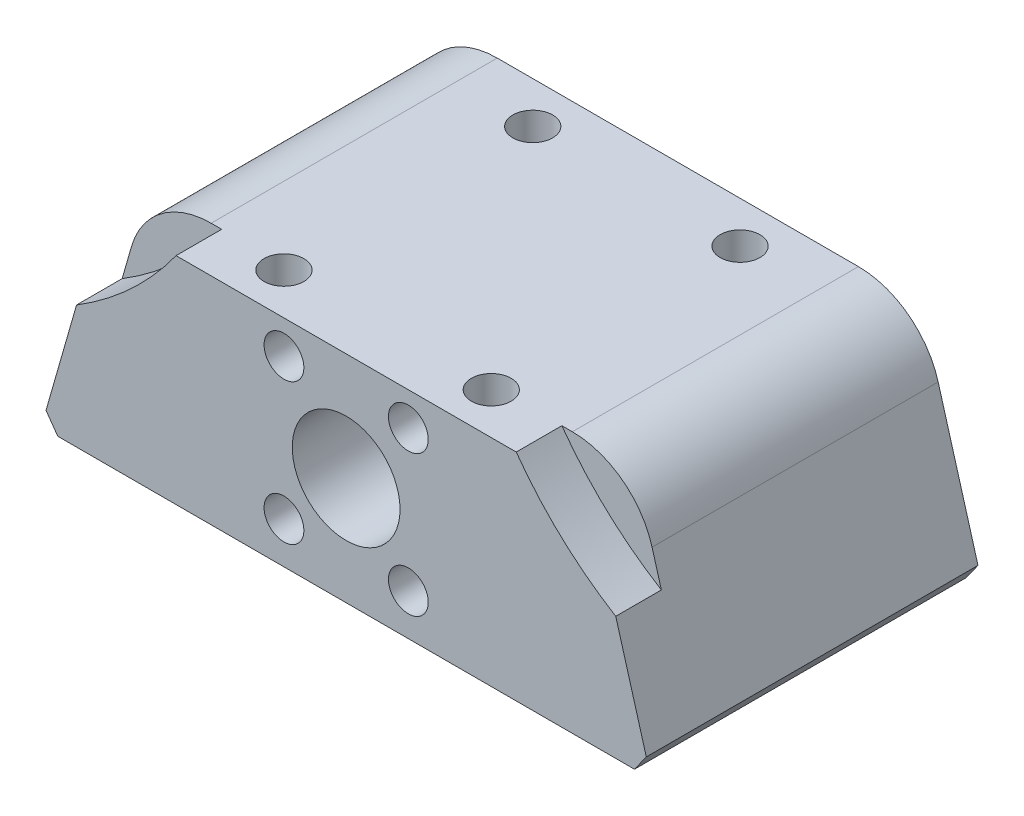
ISO-10303-21;
HEADER;
FILE_DESCRIPTION(('STEP AP214'),'2;1');
FILE_NAME('part.step','',(''),(''),'','','');
FILE_SCHEMA(('AUTOMOTIVE_DESIGN { 1 0 10303 214 1 1 1 1 }'));
ENDSEC;
DATA;
#1=APPLICATION_CONTEXT('core data for automotive mechanical design processes');
#2=APPLICATION_PROTOCOL_DEFINITION('international standard','automotive_design',2000,#1);
#3=PRODUCT_CONTEXT('',#1,'mechanical');
#4=PRODUCT('Part','Part','',(#3));
#5=PRODUCT_RELATED_PRODUCT_CATEGORY('part','',(#4));
#6=PRODUCT_DEFINITION_FORMATION('','',#4);
#7=PRODUCT_DEFINITION_CONTEXT('part definition',#1,'design');
#8=PRODUCT_DEFINITION('design','',#6,#7);
#9=PRODUCT_DEFINITION_SHAPE('','',#8);
#10=(LENGTH_UNIT() NAMED_UNIT(*) SI_UNIT(.MILLI.,.METRE.));
#11=(NAMED_UNIT(*) PLANE_ANGLE_UNIT() SI_UNIT($,.RADIAN.));
#12=(NAMED_UNIT(*) SI_UNIT($,.STERADIAN.) SOLID_ANGLE_UNIT());
#13=UNCERTAINTY_MEASURE_WITH_UNIT(LENGTH_MEASURE(1.E-05),#10,'distance_accuracy_value','');
#14=(GEOMETRIC_REPRESENTATION_CONTEXT(3) GLOBAL_UNCERTAINTY_ASSIGNED_CONTEXT((#13)) GLOBAL_UNIT_ASSIGNED_CONTEXT((#10,
#11,#12)) REPRESENTATION_CONTEXT('',''));
#15=CARTESIAN_POINT('',(0.,0.,0.));
#16=DIRECTION('',(0.,0.,1.));
#17=DIRECTION('',(1.,0.,0.));
#18=AXIS2_PLACEMENT_3D('',#15,#16,#17);
#19=CARTESIAN_POINT('',(-14.2784137068511,11.,40.));
#20=DIRECTION('',(0.,0.,-1.));
#21=DIRECTION('',(-1.,0.,0.));
#22=AXIS2_PLACEMENT_3D('',#19,#20,#21);
#23=CYLINDRICAL_SURFACE('',#22,10.);
#24=DIRECTION('',(0.,0.,-1.));
#25=VECTOR('',#24,1.);
#26=CARTESIAN_POINT('',(-23.8910306662343,13.75637355817,40.));
#27=LINE('',#26,#25);
#28=CARTESIAN_POINT('',(-23.8910306662343,13.75637355817,34.5));
#29=VERTEX_POINT('',#28);
#30=CARTESIAN_POINT('',(-23.8910306662343,13.75637355817,0.));
#31=VERTEX_POINT('',#30);
#32=EDGE_CURVE('E183',#29,#31,#27,.T.);
#33=ORIENTED_EDGE('',*,*,#32,.F.);
#34=CARTESIAN_POINT('',(-14.2784137068511,11.,34.5));
#35=DIRECTION('',(0.,0.,1.));
#36=DIRECTION('',(1.,0.,0.));
#37=AXIS2_PLACEMENT_3D('',#34,#35,#36);
#38=CIRCLE('',#37,10.);
#39=CARTESIAN_POINT('',(-14.2784137068511,21.,34.5));
#40=VERTEX_POINT('',#39);
#41=EDGE_CURVE('E185',#29,#40,#38,.F.);
#42=ORIENTED_EDGE('',*,*,#41,.T.);
#43=DIRECTION('',(0.,0.,-1.));
#44=VECTOR('',#43,1.);
#45=CARTESIAN_POINT('',(-14.2784137068511,21.,40.));
#46=LINE('',#45,#44);
#47=CARTESIAN_POINT('',(-14.2784137068511,21.,0.));
#48=VERTEX_POINT('',#47);
#49=EDGE_CURVE('E162',#48,#40,#46,.F.);
#50=ORIENTED_EDGE('',*,*,#49,.F.);
#51=CARTESIAN_POINT('',(-14.2784137068511,11.,0.));
#52=DIRECTION('',(0.,0.,1.));
#53=DIRECTION('',(1.,0.,0.));
#54=AXIS2_PLACEMENT_3D('',#51,#52,#53);
#55=CIRCLE('',#54,10.);
#56=EDGE_CURVE('E175',#31,#48,#55,.F.);
#57=ORIENTED_EDGE('',*,*,#56,.F.);
#58=EDGE_LOOP('',(#33,#42,#50,#57));
#59=FACE_BOUND('',#58,.T.);
#60=ADVANCED_FACE('F36',(#59),#23,.T.);
#61=CARTESIAN_POINT('',(0.,0.,40.));
#62=DIRECTION('',(0.,0.,1.));
#63=DIRECTION('',(1.,0.,0.));
#64=AXIS2_PLACEMENT_3D('',#61,#62,#63);
#65=PLANE('',#64);
#66=DIRECTION('',(0.580682206213755,0.814130318429873,0.));
#67=VECTOR('',#66,1.);
#68=CARTESIAN_POINT('',(43.6958434660905,-3.,40.));
#69=LINE('',#68,#67);
#70=CARTESIAN_POINT('',(42.2693342376081,-4.99999999999999,40.));
#71=VERTEX_POINT('',#70);
#72=CARTESIAN_POINT('',(43.6958434660905,-3.,40.));
#73=VERTEX_POINT('',#72);
#74=EDGE_CURVE('E50',#71,#73,#69,.T.);
#75=ORIENTED_EDGE('',*,*,#74,.T.);
#76=DIRECTION('',(-0.275637355817003,0.961261695938318,0.));
#77=VECTOR('',#76,1.);
#78=CARTESIAN_POINT('',(36.813954207879,21.,40.));
#79=LINE('',#78,#77);
#80=CARTESIAN_POINT('',(40.0118946534754,9.8474562994844,40.));
#81=VERTEX_POINT('',#80);
#82=EDGE_CURVE('E136',#73,#81,#79,.T.);
#83=ORIENTED_EDGE('',*,*,#82,.T.);
#84=CARTESIAN_POINT('',(61.5,45.,40.));
#85=DIRECTION('',(0.,0.,1.));
#86=DIRECTION('',(-1.,0.,0.));
#87=AXIS2_PLACEMENT_3D('',#84,#85,#86);
#88=CIRCLE('',#87,41.2);
#89=CARTESIAN_POINT('',(28.0120917344782,21.,40.));
#90=VERTEX_POINT('',#89);
#91=EDGE_CURVE('E210',#90,#81,#88,.T.);
#92=ORIENTED_EDGE('',*,*,#91,.F.);
#93=DIRECTION('',(-1.,0.,0.));
#94=VECTOR('',#93,1.);
#95=CARTESIAN_POINT('',(-21.813954207879,21.,40.));
#96=LINE('',#95,#94);
#97=CARTESIAN_POINT('',(-13.0120917344782,21.,40.));
#98=VERTEX_POINT('',#97);
#99=EDGE_CURVE('E146',#90,#98,#96,.T.);
#100=ORIENTED_EDGE('',*,*,#99,.T.);
#101=CARTESIAN_POINT('',(-46.5,45.,40.));
#102=DIRECTION('',(0.,0.,1.));
#103=DIRECTION('',(1.,0.,0.));
#104=AXIS2_PLACEMENT_3D('',#101,#102,#103);
#105=CIRCLE('',#104,41.2);
#106=CARTESIAN_POINT('',(-25.0118946534754,9.84745629948439,40.));
#107=VERTEX_POINT('',#106);
#108=EDGE_CURVE('E201',#107,#98,#105,.T.);
#109=ORIENTED_EDGE('',*,*,#108,.F.);
#110=DIRECTION('',(-0.275637355817003,-0.961261695938318,0.));
#111=VECTOR('',#110,1.);
#112=CARTESIAN_POINT('',(-21.813954207879,21.,40.));
#113=LINE('',#112,#111);
#114=CARTESIAN_POINT('',(-28.6958434660905,-3.00000000000001,40.));
#115=VERTEX_POINT('',#114);
#116=EDGE_CURVE('E150',#107,#115,#113,.T.);
#117=ORIENTED_EDGE('',*,*,#116,.T.);
#118=DIRECTION('',(0.580682206213759,-0.81413031842987,0.));
#119=VECTOR('',#118,1.);
#120=CARTESIAN_POINT('',(-28.6958434660905,-3.00000000000001,40.));
#121=LINE('',#120,#119);
#122=CARTESIAN_POINT('',(-27.2693342376081,-5.00000000000001,40.));
#123=VERTEX_POINT('',#122);
#124=EDGE_CURVE('E309',#115,#123,#121,.T.);
#125=ORIENTED_EDGE('',*,*,#124,.T.);
#126=DIRECTION('',(1.,0.,0.));
#127=VECTOR('',#126,1.);
#128=CARTESIAN_POINT('',(-29.2693342376081,-5.,40.));
#129=LINE('',#128,#127);
#130=EDGE_CURVE('E140',#123,#71,#129,.T.);
#131=ORIENTED_EDGE('',*,*,#130,.T.);
#132=EDGE_LOOP('',(#75,#83,#92,#100,#109,#117,#125,#131));
#133=FACE_BOUND('',#132,.T.);
#134=CARTESIAN_POINT('',(0.,0.,40.));
#135=DIRECTION('',(0.,0.,1.));
#136=DIRECTION('',(1.,0.,0.));
#137=AXIS2_PLACEMENT_3D('',#134,#135,#136);
#138=CIRCLE('',#137,2.4);
#139=CARTESIAN_POINT('',(2.4,0.,40.));
#140=VERTEX_POINT('',#139);
#141=EDGE_CURVE('E257',#140,#140,#138,.T.);
#142=ORIENTED_EDGE('',*,*,#141,.F.);
#143=EDGE_LOOP('',(#142));
#144=FACE_BOUND('',#143,.T.);
#145=CARTESIAN_POINT('',(15.,0.,40.));
#146=DIRECTION('',(0.,0.,1.));
#147=DIRECTION('',(1.,0.,0.));
#148=AXIS2_PLACEMENT_3D('',#145,#146,#147);
#149=CIRCLE('',#148,2.4);
#150=CARTESIAN_POINT('',(17.4,0.,40.));
#151=VERTEX_POINT('',#150);
#152=EDGE_CURVE('E269',#151,#151,#149,.T.);
#153=ORIENTED_EDGE('',*,*,#152,.F.);
#154=EDGE_LOOP('',(#153));
#155=FACE_BOUND('',#154,.T.);
#156=CARTESIAN_POINT('',(15.,17.,40.));
#157=DIRECTION('',(0.,0.,1.));
#158=DIRECTION('',(1.,0.,0.));
#159=AXIS2_PLACEMENT_3D('',#156,#157,#158);
#160=CIRCLE('',#159,2.4);
#161=CARTESIAN_POINT('',(17.4,17.,40.));
#162=VERTEX_POINT('',#161);
#163=EDGE_CURVE('E166',#162,#162,#160,.T.);
#164=ORIENTED_EDGE('',*,*,#163,.F.);
#165=EDGE_LOOP('',(#164));
#166=FACE_BOUND('',#165,.T.);
#167=CARTESIAN_POINT('',(0.,17.,40.));
#168=DIRECTION('',(0.,0.,1.));
#169=DIRECTION('',(1.,0.,0.));
#170=AXIS2_PLACEMENT_3D('',#167,#168,#169);
#171=CIRCLE('',#170,2.4);
#172=CARTESIAN_POINT('',(2.4,17.,40.));
#173=VERTEX_POINT('',#172);
#174=EDGE_CURVE('E263',#173,#173,#171,.T.);
#175=ORIENTED_EDGE('',*,*,#174,.F.);
#176=EDGE_LOOP('',(#175));
#177=FACE_BOUND('',#176,.T.);
#178=CARTESIAN_POINT('',(7.5,8.,40.));
#179=DIRECTION('',(0.,0.,1.));
#180=DIRECTION('',(1.,0.,0.));
#181=AXIS2_PLACEMENT_3D('',#178,#179,#180);
#182=CIRCLE('',#181,6.5);
#183=CARTESIAN_POINT('',(14.,8.,40.));
#184=VERTEX_POINT('',#183);
#185=EDGE_CURVE('E251',#184,#184,#182,.T.);
#186=ORIENTED_EDGE('',*,*,#185,.F.);
#187=EDGE_LOOP('',(#186));
#188=FACE_BOUND('',#187,.T.);
#189=ADVANCED_FACE('F133',(#133,#144,#155,#166,#177,#188),#65,.T.);
#190=CARTESIAN_POINT('',(0.,0.,0.));
#191=DIRECTION('',(0.,0.,1.));
#192=DIRECTION('',(1.,0.,0.));
#193=AXIS2_PLACEMENT_3D('',#190,#191,#192);
#194=PLANE('',#193);
#195=DIRECTION('',(-0.275637355817003,0.961261695938318,0.));
#196=VECTOR('',#195,1.);
#197=CARTESIAN_POINT('',(36.813954207879,21.,0.));
#198=LINE('',#197,#196);
#199=CARTESIAN_POINT('',(43.6958434660905,-3.,0.));
#200=VERTEX_POINT('',#199);
#201=CARTESIAN_POINT('',(38.8910306662343,13.75637355817,0.));
#202=VERTEX_POINT('',#201);
#203=EDGE_CURVE('E163',#200,#202,#198,.T.);
#204=ORIENTED_EDGE('',*,*,#203,.F.);
#205=DIRECTION('',(0.580682206213755,0.814130318429873,0.));
#206=VECTOR('',#205,1.);
#207=CARTESIAN_POINT('',(43.6958434660905,-3.,0.));
#208=LINE('',#207,#206);
#209=CARTESIAN_POINT('',(42.2693342376081,-5.,0.));
#210=VERTEX_POINT('',#209);
#211=EDGE_CURVE('E125',#210,#200,#208,.T.);
#212=ORIENTED_EDGE('',*,*,#211,.F.);
#213=DIRECTION('',(1.,0.,0.));
#214=VECTOR('',#213,1.);
#215=CARTESIAN_POINT('',(-29.2693342376081,-5.,0.));
#216=LINE('',#215,#214);
#217=CARTESIAN_POINT('',(-27.2693342376081,-5.,0.));
#218=VERTEX_POINT('',#217);
#219=EDGE_CURVE('E147',#218,#210,#216,.T.);
#220=ORIENTED_EDGE('',*,*,#219,.F.);
#221=DIRECTION('',(0.580682206213759,-0.81413031842987,0.));
#222=VECTOR('',#221,1.);
#223=CARTESIAN_POINT('',(-28.6958434660905,-3.00000000000001,0.));
#224=LINE('',#223,#222);
#225=CARTESIAN_POINT('',(-28.6958434660905,-3.00000000000001,0.));
#226=VERTEX_POINT('',#225);
#227=EDGE_CURVE('E58',#226,#218,#224,.T.);
#228=ORIENTED_EDGE('',*,*,#227,.F.);
#229=DIRECTION('',(-0.275637355817003,-0.961261695938318,0.));
#230=VECTOR('',#229,1.);
#231=CARTESIAN_POINT('',(-21.813954207879,21.,0.));
#232=LINE('',#231,#230);
#233=EDGE_CURVE('E153',#31,#226,#232,.T.);
#234=ORIENTED_EDGE('',*,*,#233,.F.);
#235=ORIENTED_EDGE('',*,*,#56,.T.);
#236=DIRECTION('',(-1.,0.,0.));
#237=VECTOR('',#236,1.);
#238=CARTESIAN_POINT('',(-21.813954207879,21.,0.));
#239=LINE('',#238,#237);
#240=CARTESIAN_POINT('',(29.2784137068511,21.,0.));
#241=VERTEX_POINT('',#240);
#242=EDGE_CURVE('E165',#241,#48,#239,.T.);
#243=ORIENTED_EDGE('',*,*,#242,.F.);
#244=CARTESIAN_POINT('',(29.2784137068511,11.,0.));
#245=DIRECTION('',(0.,0.,1.));
#246=DIRECTION('',(1.,0.,0.));
#247=AXIS2_PLACEMENT_3D('',#244,#245,#246);
#248=CIRCLE('',#247,10.);
#249=EDGE_CURVE('E177',#241,#202,#248,.F.);
#250=ORIENTED_EDGE('',*,*,#249,.T.);
#251=EDGE_LOOP('',(#204,#212,#220,#228,#234,#235,#243,#250));
#252=FACE_BOUND('',#251,.T.);
#253=CARTESIAN_POINT('',(15.,17.,0.));
#254=DIRECTION('',(0.,0.,1.));
#255=DIRECTION('',(1.,0.,0.));
#256=AXIS2_PLACEMENT_3D('',#253,#254,#255);
#257=CIRCLE('',#256,2.4);
#258=CARTESIAN_POINT('',(17.4,17.,0.));
#259=VERTEX_POINT('',#258);
#260=EDGE_CURVE('E156',#259,#259,#257,.T.);
#261=ORIENTED_EDGE('',*,*,#260,.T.);
#262=EDGE_LOOP('',(#261));
#263=FACE_BOUND('',#262,.T.);
#264=CARTESIAN_POINT('',(15.,0.,0.));
#265=DIRECTION('',(0.,0.,1.));
#266=DIRECTION('',(1.,0.,0.));
#267=AXIS2_PLACEMENT_3D('',#264,#265,#266);
#268=CIRCLE('',#267,2.4);
#269=CARTESIAN_POINT('',(17.4,0.,0.));
#270=VERTEX_POINT('',#269);
#271=EDGE_CURVE('E266',#270,#270,#268,.T.);
#272=ORIENTED_EDGE('',*,*,#271,.T.);
#273=EDGE_LOOP('',(#272));
#274=FACE_BOUND('',#273,.T.);
#275=CARTESIAN_POINT('',(0.,17.,0.));
#276=DIRECTION('',(0.,0.,1.));
#277=DIRECTION('',(1.,0.,0.));
#278=AXIS2_PLACEMENT_3D('',#275,#276,#277);
#279=CIRCLE('',#278,2.4);
#280=CARTESIAN_POINT('',(2.4,17.,0.));
#281=VERTEX_POINT('',#280);
#282=EDGE_CURVE('E260',#281,#281,#279,.T.);
#283=ORIENTED_EDGE('',*,*,#282,.T.);
#284=EDGE_LOOP('',(#283));
#285=FACE_BOUND('',#284,.T.);
#286=CARTESIAN_POINT('',(0.,0.,0.));
#287=DIRECTION('',(0.,0.,1.));
#288=DIRECTION('',(1.,0.,0.));
#289=AXIS2_PLACEMENT_3D('',#286,#287,#288);
#290=CIRCLE('',#289,2.4);
#291=CARTESIAN_POINT('',(2.4,0.,0.));
#292=VERTEX_POINT('',#291);
#293=EDGE_CURVE('E254',#292,#292,#290,.T.);
#294=ORIENTED_EDGE('',*,*,#293,.T.);
#295=EDGE_LOOP('',(#294));
#296=FACE_BOUND('',#295,.T.);
#297=CARTESIAN_POINT('',(7.5,8.,0.));
#298=DIRECTION('',(0.,0.,1.));
#299=DIRECTION('',(1.,0.,0.));
#300=AXIS2_PLACEMENT_3D('',#297,#298,#299);
#301=CIRCLE('',#300,6.5);
#302=CARTESIAN_POINT('',(14.,8.,0.));
#303=VERTEX_POINT('',#302);
#304=EDGE_CURVE('E248',#303,#303,#301,.T.);
#305=ORIENTED_EDGE('',*,*,#304,.T.);
#306=EDGE_LOOP('',(#305));
#307=FACE_BOUND('',#306,.T.);
#308=ADVANCED_FACE('F279',(#252,#263,#274,#285,#296,#307),#194,.F.);
#309=CARTESIAN_POINT('',(36.813954207879,21.,40.));
#310=DIRECTION('',(-0.961261695938318,-0.275637355817003,0.));
#311=DIRECTION('',(0.275637355817003,-0.961261695938318,0.));
#312=AXIS2_PLACEMENT_3D('',#309,#310,#311);
#313=PLANE('',#312);
#314=ORIENTED_EDGE('',*,*,#82,.F.);
#315=DIRECTION('',(0.,0.,-1.));
#316=VECTOR('',#315,1.);
#317=CARTESIAN_POINT('',(43.6958434660905,-3.,40.));
#318=LINE('',#317,#316);
#319=EDGE_CURVE('E122',#73,#200,#318,.T.);
#320=ORIENTED_EDGE('',*,*,#319,.T.);
#321=ORIENTED_EDGE('',*,*,#203,.T.);
#322=DIRECTION('',(0.,0.,-1.));
#323=VECTOR('',#322,1.);
#324=CARTESIAN_POINT('',(38.8910306662343,13.75637355817,40.));
#325=LINE('',#324,#323);
#326=CARTESIAN_POINT('',(38.8910306662343,13.75637355817,34.5));
#327=VERTEX_POINT('',#326);
#328=EDGE_CURVE('E180',#202,#327,#325,.F.);
#329=ORIENTED_EDGE('',*,*,#328,.T.);
#330=DIRECTION('',(0.275637355817003,-0.961261695938318,0.));
#331=VECTOR('',#330,1.);
#332=CARTESIAN_POINT('',(36.813954207879,21.,34.5));
#333=LINE('',#332,#331);
#334=CARTESIAN_POINT('',(40.0118946534754,9.8474562994844,34.5));
#335=VERTEX_POINT('',#334);
#336=EDGE_CURVE('E221',#327,#335,#333,.T.);
#337=ORIENTED_EDGE('',*,*,#336,.T.);
#338=DIRECTION('',(0.,0.,1.));
#339=VECTOR('',#338,1.);
#340=CARTESIAN_POINT('',(40.0118946534754,9.8474562994844,34.5));
#341=LINE('',#340,#339);
#342=EDGE_CURVE('E145',#335,#81,#341,.T.);
#343=ORIENTED_EDGE('',*,*,#342,.T.);
#344=EDGE_LOOP('',(#314,#320,#321,#329,#337,#343));
#345=FACE_BOUND('',#344,.T.);
#346=ADVANCED_FACE('F143',(#345),#313,.F.);
#347=CARTESIAN_POINT('',(-21.813954207879,21.,40.));
#348=DIRECTION('',(0.,-1.,0.));
#349=DIRECTION('',(1.,0.,0.));
#350=AXIS2_PLACEMENT_3D('',#347,#348,#349);
#351=PLANE('',#350);
#352=CARTESIAN_POINT('',(20.,21.,5.));
#353=DIRECTION('',(0.,1.,0.));
#354=DIRECTION('',(-1.,0.,0.));
#355=AXIS2_PLACEMENT_3D('',#352,#353,#354);
#356=CIRCLE('',#355,2.4);
#357=CARTESIAN_POINT('',(17.6,21.,5.));
#358=VERTEX_POINT('',#357);
#359=EDGE_CURVE('E237',#358,#358,#356,.T.);
#360=ORIENTED_EDGE('',*,*,#359,.F.);
#361=EDGE_LOOP('',(#360));
#362=FACE_BOUND('',#361,.T.);
#363=CARTESIAN_POINT('',(-5.00000000000001,21.,35.));
#364=DIRECTION('',(0.,1.,0.));
#365=DIRECTION('',(-1.,0.,0.));
#366=AXIS2_PLACEMENT_3D('',#363,#364,#365);
#367=CIRCLE('',#366,2.4);
#368=CARTESIAN_POINT('',(-7.40000000000001,21.,35.));
#369=VERTEX_POINT('',#368);
#370=EDGE_CURVE('E230',#369,#369,#367,.T.);
#371=ORIENTED_EDGE('',*,*,#370,.F.);
#372=EDGE_LOOP('',(#371));
#373=FACE_BOUND('',#372,.T.);
#374=CARTESIAN_POINT('',(20.,21.,35.));
#375=DIRECTION('',(0.,1.,0.));
#376=DIRECTION('',(-1.,0.,0.));
#377=AXIS2_PLACEMENT_3D('',#374,#375,#376);
#378=CIRCLE('',#377,2.4);
#379=CARTESIAN_POINT('',(17.6,21.,35.));
#380=VERTEX_POINT('',#379);
#381=EDGE_CURVE('E226',#380,#380,#378,.T.);
#382=ORIENTED_EDGE('',*,*,#381,.F.);
#383=EDGE_LOOP('',(#382));
#384=FACE_BOUND('',#383,.T.);
#385=CARTESIAN_POINT('',(-5.00000000000001,21.,5.));
#386=DIRECTION('',(0.,1.,0.));
#387=DIRECTION('',(-1.,0.,0.));
#388=AXIS2_PLACEMENT_3D('',#385,#386,#387);
#389=CIRCLE('',#388,2.4);
#390=CARTESIAN_POINT('',(-7.40000000000001,21.,5.));
#391=VERTEX_POINT('',#390);
#392=EDGE_CURVE('E236',#391,#391,#389,.T.);
#393=ORIENTED_EDGE('',*,*,#392,.F.);
#394=EDGE_LOOP('',(#393));
#395=FACE_BOUND('',#394,.T.);
#396=DIRECTION('',(-1.,0.,0.));
#397=VECTOR('',#396,1.);
#398=CARTESIAN_POINT('',(-21.813954207879,21.,34.5));
#399=LINE('',#398,#397);
#400=CARTESIAN_POINT('',(-13.0120917344782,21.,34.5));
#401=VERTEX_POINT('',#400);
#402=EDGE_CURVE('E216',#401,#40,#399,.T.);
#403=ORIENTED_EDGE('',*,*,#402,.F.);
#404=DIRECTION('',(0.,0.,1.));
#405=VECTOR('',#404,1.);
#406=CARTESIAN_POINT('',(-13.0120917344782,21.,34.5));
#407=LINE('',#406,#405);
#408=EDGE_CURVE('E223',#401,#98,#407,.T.);
#409=ORIENTED_EDGE('',*,*,#408,.T.);
#410=ORIENTED_EDGE('',*,*,#99,.F.);
#411=DIRECTION('',(0.,0.,1.));
#412=VECTOR('',#411,1.);
#413=CARTESIAN_POINT('',(28.0120917344782,21.,34.5));
#414=LINE('',#413,#412);
#415=CARTESIAN_POINT('',(28.0120917344782,21.,34.5));
#416=VERTEX_POINT('',#415);
#417=EDGE_CURVE('E11',#90,#416,#414,.F.);
#418=ORIENTED_EDGE('',*,*,#417,.T.);
#419=DIRECTION('',(1.,0.,0.));
#420=VECTOR('',#419,1.);
#421=CARTESIAN_POINT('',(-21.813954207879,21.,34.5));
#422=LINE('',#421,#420);
#423=CARTESIAN_POINT('',(29.2784137068511,21.,34.5));
#424=VERTEX_POINT('',#423);
#425=EDGE_CURVE('E218',#416,#424,#422,.T.);
#426=ORIENTED_EDGE('',*,*,#425,.T.);
#427=DIRECTION('',(0.,0.,-1.));
#428=VECTOR('',#427,1.);
#429=CARTESIAN_POINT('',(29.2784137068511,21.,40.));
#430=LINE('',#429,#428);
#431=EDGE_CURVE('E173',#424,#241,#430,.T.);
#432=ORIENTED_EDGE('',*,*,#431,.T.);
#433=ORIENTED_EDGE('',*,*,#242,.T.);
#434=ORIENTED_EDGE('',*,*,#49,.T.);
#435=EDGE_LOOP('',(#403,#409,#410,#418,#426,#432,#433,#434));
#436=FACE_BOUND('',#435,.T.);
#437=ADVANCED_FACE('F329',(#362,#373,#384,#395,#436),#351,.F.);
#438=CARTESIAN_POINT('',(-21.813954207879,21.,40.));
#439=DIRECTION('',(0.961261695938318,-0.275637355817003,0.));
#440=DIRECTION('',(0.275637355817003,0.961261695938318,0.));
#441=AXIS2_PLACEMENT_3D('',#438,#439,#440);
#442=PLANE('',#441);
#443=ORIENTED_EDGE('',*,*,#233,.T.);
#444=DIRECTION('',(0.,0.,-1.));
#445=VECTOR('',#444,1.);
#446=CARTESIAN_POINT('',(-28.6958434660905,-3.00000000000001,40.));
#447=LINE('',#446,#445);
#448=EDGE_CURVE('E305',#115,#226,#447,.T.);
#449=ORIENTED_EDGE('',*,*,#448,.F.);
#450=ORIENTED_EDGE('',*,*,#116,.F.);
#451=DIRECTION('',(0.,0.,1.));
#452=VECTOR('',#451,1.);
#453=CARTESIAN_POINT('',(-25.0118946534754,9.8474562994844,34.5));
#454=LINE('',#453,#452);
#455=CARTESIAN_POINT('',(-25.0118946534754,9.84745629948439,34.5));
#456=VERTEX_POINT('',#455);
#457=EDGE_CURVE('E43',#107,#456,#454,.F.);
#458=ORIENTED_EDGE('',*,*,#457,.T.);
#459=DIRECTION('',(-0.275637355817003,-0.961261695938318,0.));
#460=VECTOR('',#459,1.);
#461=CARTESIAN_POINT('',(-21.813954207879,21.,34.5));
#462=LINE('',#461,#460);
#463=EDGE_CURVE('E194',#29,#456,#462,.T.);
#464=ORIENTED_EDGE('',*,*,#463,.F.);
#465=ORIENTED_EDGE('',*,*,#32,.T.);
#466=EDGE_LOOP('',(#443,#449,#450,#458,#464,#465));
#467=FACE_BOUND('',#466,.T.);
#468=ADVANCED_FACE('F193',(#467),#442,.F.);
#469=CARTESIAN_POINT('',(-29.2693342376081,-5.,40.));
#470=DIRECTION('',(0.,1.,0.));
#471=DIRECTION('',(-1.,0.,0.));
#472=AXIS2_PLACEMENT_3D('',#469,#470,#471);
#473=PLANE('',#472);
#474=CARTESIAN_POINT('',(20.,-5.,5.));
#475=DIRECTION('',(0.,1.,0.));
#476=DIRECTION('',(-1.,0.,0.));
#477=AXIS2_PLACEMENT_3D('',#474,#475,#476);
#478=CIRCLE('',#477,2.4);
#479=CARTESIAN_POINT('',(17.6,-5.,5.));
#480=VERTEX_POINT('',#479);
#481=EDGE_CURVE('E233',#480,#480,#478,.T.);
#482=ORIENTED_EDGE('',*,*,#481,.T.);
#483=EDGE_LOOP('',(#482));
#484=FACE_BOUND('',#483,.T.);
#485=CARTESIAN_POINT('',(-5.,-5.00000000000001,35.));
#486=DIRECTION('',(0.,1.,0.));
#487=DIRECTION('',(-1.,0.,0.));
#488=AXIS2_PLACEMENT_3D('',#485,#486,#487);
#489=CIRCLE('',#488,2.4);
#490=CARTESIAN_POINT('',(-7.4,-5.00000000000001,35.));
#491=VERTEX_POINT('',#490);
#492=EDGE_CURVE('E240',#491,#491,#489,.T.);
#493=ORIENTED_EDGE('',*,*,#492,.T.);
#494=EDGE_LOOP('',(#493));
#495=FACE_BOUND('',#494,.T.);
#496=CARTESIAN_POINT('',(20.,-5.,35.));
#497=DIRECTION('',(0.,1.,0.));
#498=DIRECTION('',(-1.,0.,0.));
#499=AXIS2_PLACEMENT_3D('',#496,#497,#498);
#500=CIRCLE('',#499,2.4);
#501=CARTESIAN_POINT('',(17.6,-5.,35.));
#502=VERTEX_POINT('',#501);
#503=EDGE_CURVE('E227',#502,#502,#500,.T.);
#504=ORIENTED_EDGE('',*,*,#503,.T.);
#505=EDGE_LOOP('',(#504));
#506=FACE_BOUND('',#505,.T.);
#507=CARTESIAN_POINT('',(-5.00000000000001,-5.00000000000001,5.));
#508=DIRECTION('',(0.,1.,0.));
#509=DIRECTION('',(-1.,0.,0.));
#510=AXIS2_PLACEMENT_3D('',#507,#508,#509);
#511=CIRCLE('',#510,2.4);
#512=CARTESIAN_POINT('',(-7.40000000000001,-5.00000000000001,5.));
#513=VERTEX_POINT('',#512);
#514=EDGE_CURVE('E245',#513,#513,#511,.T.);
#515=ORIENTED_EDGE('',*,*,#514,.T.);
#516=EDGE_LOOP('',(#515));
#517=FACE_BOUND('',#516,.T.);
#518=ORIENTED_EDGE('',*,*,#219,.T.);
#519=DIRECTION('',(0.,0.,-1.));
#520=VECTOR('',#519,1.);
#521=CARTESIAN_POINT('',(42.2693342376081,-5.,40.));
#522=LINE('',#521,#520);
#523=EDGE_CURVE('E129',#71,#210,#522,.T.);
#524=ORIENTED_EDGE('',*,*,#523,.F.);
#525=ORIENTED_EDGE('',*,*,#130,.F.);
#526=DIRECTION('',(0.,0.,-1.));
#527=VECTOR('',#526,1.);
#528=CARTESIAN_POINT('',(-27.2693342376081,-5.00000000000001,40.));
#529=LINE('',#528,#527);
#530=EDGE_CURVE('E313',#123,#218,#529,.T.);
#531=ORIENTED_EDGE('',*,*,#530,.T.);
#532=EDGE_LOOP('',(#518,#524,#525,#531));
#533=FACE_BOUND('',#532,.T.);
#534=ADVANCED_FACE('F285',(#484,#495,#506,#517,#533),#473,.F.);
#535=CARTESIAN_POINT('',(15.,17.,40.));
#536=DIRECTION('',(0.,0.,-1.));
#537=DIRECTION('',(-1.,0.,0.));
#538=AXIS2_PLACEMENT_3D('',#535,#536,#537);
#539=CYLINDRICAL_SURFACE('',#538,2.4);
#540=ORIENTED_EDGE('',*,*,#163,.T.);
#541=EDGE_LOOP('',(#540));
#542=FACE_BOUND('',#541,.T.);
#543=ORIENTED_EDGE('',*,*,#260,.F.);
#544=EDGE_LOOP('',(#543));
#545=FACE_BOUND('',#544,.T.);
#546=ADVANCED_FACE('F282',(#542,#545),#539,.F.);
#547=CARTESIAN_POINT('',(15.,0.,40.));
#548=DIRECTION('',(0.,0.,-1.));
#549=DIRECTION('',(-1.,0.,0.));
#550=AXIS2_PLACEMENT_3D('',#547,#548,#549);
#551=CYLINDRICAL_SURFACE('',#550,2.4);
#552=ORIENTED_EDGE('',*,*,#152,.T.);
#553=EDGE_LOOP('',(#552));
#554=FACE_BOUND('',#553,.T.);
#555=ORIENTED_EDGE('',*,*,#271,.F.);
#556=EDGE_LOOP('',(#555));
#557=FACE_BOUND('',#556,.T.);
#558=ADVANCED_FACE('F284',(#554,#557),#551,.F.);
#559=CARTESIAN_POINT('',(0.,17.,40.));
#560=DIRECTION('',(0.,0.,-1.));
#561=DIRECTION('',(-1.,0.,0.));
#562=AXIS2_PLACEMENT_3D('',#559,#560,#561);
#563=CYLINDRICAL_SURFACE('',#562,2.4);
#564=ORIENTED_EDGE('',*,*,#174,.T.);
#565=EDGE_LOOP('',(#564));
#566=FACE_BOUND('',#565,.T.);
#567=ORIENTED_EDGE('',*,*,#282,.F.);
#568=EDGE_LOOP('',(#567));
#569=FACE_BOUND('',#568,.T.);
#570=ADVANCED_FACE('F291',(#566,#569),#563,.F.);
#571=CARTESIAN_POINT('',(0.,0.,40.));
#572=DIRECTION('',(0.,0.,-1.));
#573=DIRECTION('',(-1.,0.,0.));
#574=AXIS2_PLACEMENT_3D('',#571,#572,#573);
#575=CYLINDRICAL_SURFACE('',#574,2.4);
#576=ORIENTED_EDGE('',*,*,#141,.T.);
#577=EDGE_LOOP('',(#576));
#578=FACE_BOUND('',#577,.T.);
#579=ORIENTED_EDGE('',*,*,#293,.F.);
#580=EDGE_LOOP('',(#579));
#581=FACE_BOUND('',#580,.T.);
#582=ADVANCED_FACE('F363',(#578,#581),#575,.F.);
#583=CARTESIAN_POINT('',(7.5,8.,40.));
#584=DIRECTION('',(0.,0.,-1.));
#585=DIRECTION('',(-1.,0.,0.));
#586=AXIS2_PLACEMENT_3D('',#583,#584,#585);
#587=CYLINDRICAL_SURFACE('',#586,6.5);
#588=ORIENTED_EDGE('',*,*,#185,.T.);
#589=EDGE_LOOP('',(#588));
#590=FACE_BOUND('',#589,.T.);
#591=ORIENTED_EDGE('',*,*,#304,.F.);
#592=EDGE_LOOP('',(#591));
#593=FACE_BOUND('',#592,.T.);
#594=ADVANCED_FACE('F360',(#590,#593),#587,.F.);
#595=CARTESIAN_POINT('',(29.2784137068511,11.,40.));
#596=DIRECTION('',(0.,0.,-1.));
#597=DIRECTION('',(-1.,0.,0.));
#598=AXIS2_PLACEMENT_3D('',#595,#596,#597);
#599=CYLINDRICAL_SURFACE('',#598,10.);
#600=CARTESIAN_POINT('',(29.2784137068511,11.,34.5));
#601=DIRECTION('',(0.,0.,-1.));
#602=DIRECTION('',(-1.,0.,0.));
#603=AXIS2_PLACEMENT_3D('',#600,#601,#602);
#604=CIRCLE('',#603,10.);
#605=EDGE_CURVE('E188',#327,#424,#604,.F.);
#606=ORIENTED_EDGE('',*,*,#605,.F.);
#607=ORIENTED_EDGE('',*,*,#328,.F.);
#608=ORIENTED_EDGE('',*,*,#249,.F.);
#609=ORIENTED_EDGE('',*,*,#431,.F.);
#610=EDGE_LOOP('',(#606,#607,#608,#609));
#611=FACE_BOUND('',#610,.T.);
#612=ADVANCED_FACE('F322',(#611),#599,.T.);
#613=CARTESIAN_POINT('',(-5.00000000000001,-5.00000000000001,5.));
#614=DIRECTION('',(0.,1.,0.));
#615=DIRECTION('',(-1.,0.,0.));
#616=AXIS2_PLACEMENT_3D('',#613,#614,#615);
#617=CYLINDRICAL_SURFACE('',#616,2.4);
#618=ORIENTED_EDGE('',*,*,#514,.F.);
#619=EDGE_LOOP('',(#618));
#620=FACE_BOUND('',#619,.T.);
#621=ORIENTED_EDGE('',*,*,#392,.T.);
#622=EDGE_LOOP('',(#621));
#623=FACE_BOUND('',#622,.T.);
#624=ADVANCED_FACE('F348',(#620,#623),#617,.F.);
#625=CARTESIAN_POINT('',(20.,-5.,35.));
#626=DIRECTION('',(0.,1.,0.));
#627=DIRECTION('',(-1.,0.,0.));
#628=AXIS2_PLACEMENT_3D('',#625,#626,#627);
#629=CYLINDRICAL_SURFACE('',#628,2.4);
#630=ORIENTED_EDGE('',*,*,#503,.F.);
#631=EDGE_LOOP('',(#630));
#632=FACE_BOUND('',#631,.T.);
#633=ORIENTED_EDGE('',*,*,#381,.T.);
#634=EDGE_LOOP('',(#633));
#635=FACE_BOUND('',#634,.T.);
#636=ADVANCED_FACE('F344',(#632,#635),#629,.F.);
#637=CARTESIAN_POINT('',(-5.,-5.00000000000001,35.));
#638=DIRECTION('',(0.,1.,0.));
#639=DIRECTION('',(-1.,0.,0.));
#640=AXIS2_PLACEMENT_3D('',#637,#638,#639);
#641=CYLINDRICAL_SURFACE('',#640,2.4);
#642=ORIENTED_EDGE('',*,*,#492,.F.);
#643=EDGE_LOOP('',(#642));
#644=FACE_BOUND('',#643,.T.);
#645=ORIENTED_EDGE('',*,*,#370,.T.);
#646=EDGE_LOOP('',(#645));
#647=FACE_BOUND('',#646,.T.);
#648=ADVANCED_FACE('F347',(#644,#647),#641,.F.);
#649=CARTESIAN_POINT('',(20.,-5.,5.));
#650=DIRECTION('',(0.,1.,0.));
#651=DIRECTION('',(-1.,0.,0.));
#652=AXIS2_PLACEMENT_3D('',#649,#650,#651);
#653=CYLINDRICAL_SURFACE('',#652,2.4);
#654=ORIENTED_EDGE('',*,*,#481,.F.);
#655=EDGE_LOOP('',(#654));
#656=FACE_BOUND('',#655,.T.);
#657=ORIENTED_EDGE('',*,*,#359,.T.);
#658=EDGE_LOOP('',(#657));
#659=FACE_BOUND('',#658,.T.);
#660=ADVANCED_FACE('F350',(#656,#659),#653,.F.);
#661=CARTESIAN_POINT('',(-46.5,45.,34.5));
#662=DIRECTION('',(0.,0.,1.));
#663=DIRECTION('',(1.,0.,0.));
#664=AXIS2_PLACEMENT_3D('',#661,#662,#663);
#665=CYLINDRICAL_SURFACE('',#664,41.2);
#666=CARTESIAN_POINT('',(-46.5,45.,34.5));
#667=DIRECTION('',(0.,0.,1.));
#668=DIRECTION('',(1.,0.,0.));
#669=AXIS2_PLACEMENT_3D('',#666,#667,#668);
#670=CIRCLE('',#669,41.2);
#671=EDGE_CURVE('E204',#456,#401,#670,.T.);
#672=ORIENTED_EDGE('',*,*,#671,.F.);
#673=ORIENTED_EDGE('',*,*,#457,.F.);
#674=ORIENTED_EDGE('',*,*,#108,.T.);
#675=ORIENTED_EDGE('',*,*,#408,.F.);
#676=EDGE_LOOP('',(#672,#673,#674,#675));
#677=FACE_BOUND('',#676,.T.);
#678=ADVANCED_FACE('F200',(#677),#665,.F.);
#679=CARTESIAN_POINT('',(-46.5,45.,34.5));
#680=DIRECTION('',(0.,0.,1.));
#681=DIRECTION('',(1.,0.,0.));
#682=AXIS2_PLACEMENT_3D('',#679,#680,#681);
#683=PLANE('',#682);
#684=ORIENTED_EDGE('',*,*,#402,.T.);
#685=ORIENTED_EDGE('',*,*,#41,.F.);
#686=ORIENTED_EDGE('',*,*,#463,.T.);
#687=ORIENTED_EDGE('',*,*,#671,.T.);
#688=EDGE_LOOP('',(#684,#685,#686,#687));
#689=FACE_BOUND('',#688,.T.);
#690=ADVANCED_FACE('F333',(#689),#683,.T.);
#691=CARTESIAN_POINT('',(61.5,45.,34.5));
#692=DIRECTION('',(0.,0.,1.));
#693=DIRECTION('',(1.,0.,0.));
#694=AXIS2_PLACEMENT_3D('',#691,#692,#693);
#695=CYLINDRICAL_SURFACE('',#694,41.2);
#696=CARTESIAN_POINT('',(61.5,45.,34.5));
#697=DIRECTION('',(0.,0.,1.));
#698=DIRECTION('',(-1.,0.,0.));
#699=AXIS2_PLACEMENT_3D('',#696,#697,#698);
#700=CIRCLE('',#699,41.2);
#701=EDGE_CURVE('E206',#416,#335,#700,.T.);
#702=ORIENTED_EDGE('',*,*,#701,.F.);
#703=ORIENTED_EDGE('',*,*,#417,.F.);
#704=ORIENTED_EDGE('',*,*,#91,.T.);
#705=ORIENTED_EDGE('',*,*,#342,.F.);
#706=EDGE_LOOP('',(#702,#703,#704,#705));
#707=FACE_BOUND('',#706,.T.);
#708=ADVANCED_FACE('F331',(#707),#695,.F.);
#709=CARTESIAN_POINT('',(61.5,45.,34.5));
#710=DIRECTION('',(0.,0.,-1.));
#711=DIRECTION('',(-1.,0.,0.));
#712=AXIS2_PLACEMENT_3D('',#709,#710,#711);
#713=PLANE('',#712);
#714=ORIENTED_EDGE('',*,*,#605,.T.);
#715=ORIENTED_EDGE('',*,*,#425,.F.);
#716=ORIENTED_EDGE('',*,*,#701,.T.);
#717=ORIENTED_EDGE('',*,*,#336,.F.);
#718=EDGE_LOOP('',(#714,#715,#716,#717));
#719=FACE_BOUND('',#718,.T.);
#720=ADVANCED_FACE('F325',(#719),#713,.F.);
#721=CARTESIAN_POINT('',(-28.6958434660905,-3.00000000000001,40.));
#722=DIRECTION('',(0.81413031842987,0.580682206213759,0.));
#723=DIRECTION('',(-0.580682206213759,0.81413031842987,0.));
#724=AXIS2_PLACEMENT_3D('',#721,#722,#723);
#725=PLANE('',#724);
#726=ORIENTED_EDGE('',*,*,#227,.T.);
#727=ORIENTED_EDGE('',*,*,#530,.F.);
#728=ORIENTED_EDGE('',*,*,#124,.F.);
#729=ORIENTED_EDGE('',*,*,#448,.T.);
#730=EDGE_LOOP('',(#726,#727,#728,#729));
#731=FACE_BOUND('',#730,.T.);
#732=ADVANCED_FACE('F314',(#731),#725,.F.);
#733=CARTESIAN_POINT('',(43.6958434660905,-3.,40.));
#734=DIRECTION('',(-0.814130318429873,0.580682206213755,0.));
#735=DIRECTION('',(-0.580682206213755,-0.814130318429873,0.));
#736=AXIS2_PLACEMENT_3D('',#733,#734,#735);
#737=PLANE('',#736);
#738=ORIENTED_EDGE('',*,*,#211,.T.);
#739=ORIENTED_EDGE('',*,*,#319,.F.);
#740=ORIENTED_EDGE('',*,*,#74,.F.);
#741=ORIENTED_EDGE('',*,*,#523,.T.);
#742=EDGE_LOOP('',(#738,#739,#740,#741));
#743=FACE_BOUND('',#742,.T.);
#744=ADVANCED_FACE('F123',(#743),#737,.F.);
#745=CLOSED_SHELL('',(#60,#189,#308,#346,#437,#468,#534,#546,#558,#570,#582,#594,#612,#624,#636,
#648,#660,#678,#690,#708,#720,#732,#744));
#746=MANIFOLD_SOLID_BREP('B2',#745);
#747=ADVANCED_BREP_SHAPE_REPRESENTATION('',(#18,#746),#14);
#748=SHAPE_DEFINITION_REPRESENTATION(#9,#747);
ENDSEC;
END-ISO-10303-21;
